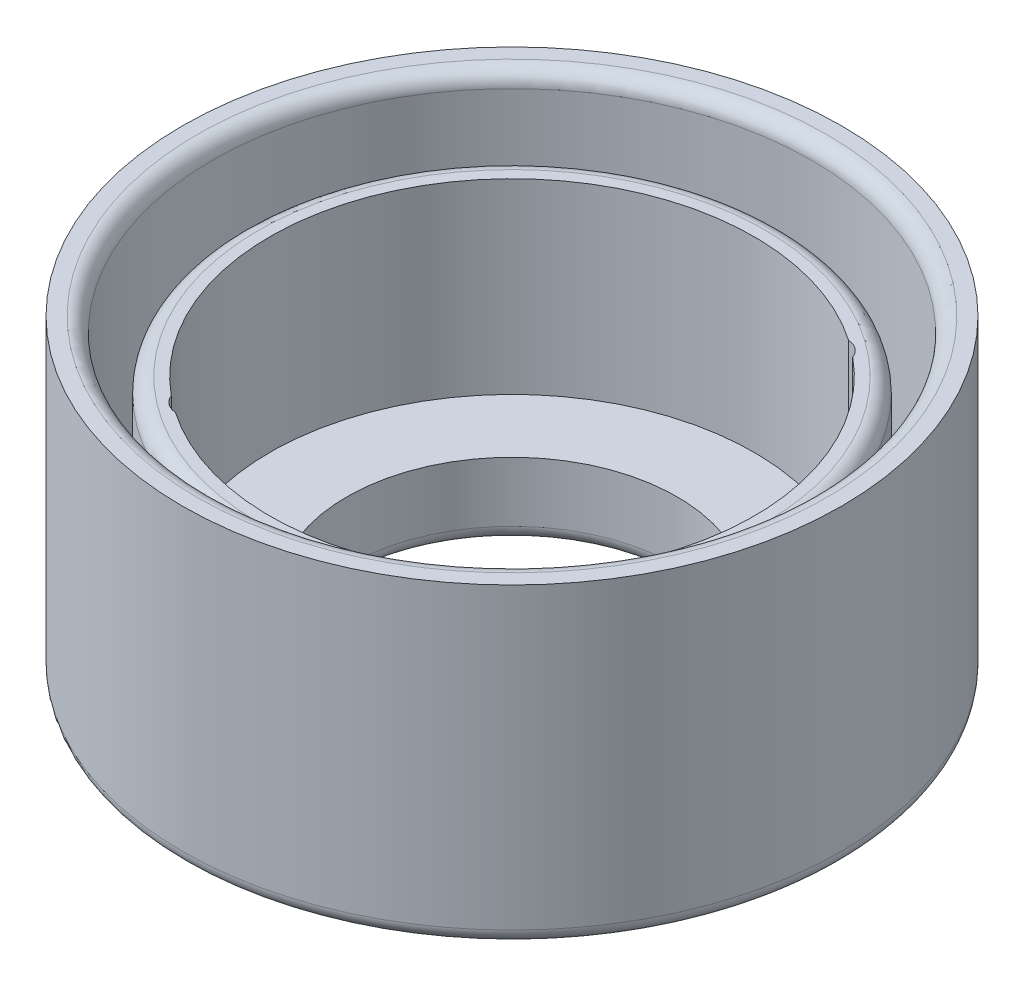
ISO-10303-21;
HEADER;
FILE_DESCRIPTION(('STEP AP214'),'2;1');
FILE_NAME('part.step','',(''),(''),'','','');
FILE_SCHEMA(('AUTOMOTIVE_DESIGN { 1 0 10303 214 1 1 1 1 }'));
ENDSEC;
DATA;
#1=APPLICATION_CONTEXT('core data for automotive mechanical design processes');
#2=APPLICATION_PROTOCOL_DEFINITION('international standard','automotive_design',2000,#1);
#3=PRODUCT_CONTEXT('',#1,'mechanical');
#4=PRODUCT('Part','Part','',(#3));
#5=PRODUCT_RELATED_PRODUCT_CATEGORY('part','',(#4));
#6=PRODUCT_DEFINITION_FORMATION('','',#4);
#7=PRODUCT_DEFINITION_CONTEXT('part definition',#1,'design');
#8=PRODUCT_DEFINITION('design','',#6,#7);
#9=PRODUCT_DEFINITION_SHAPE('','',#8);
#10=(LENGTH_UNIT() NAMED_UNIT(*) SI_UNIT(.MILLI.,.METRE.));
#11=(NAMED_UNIT(*) PLANE_ANGLE_UNIT() SI_UNIT($,.RADIAN.));
#12=(NAMED_UNIT(*) SI_UNIT($,.STERADIAN.) SOLID_ANGLE_UNIT());
#13=UNCERTAINTY_MEASURE_WITH_UNIT(LENGTH_MEASURE(1.E-05),#10,'distance_accuracy_value','');
#14=(GEOMETRIC_REPRESENTATION_CONTEXT(3) GLOBAL_UNCERTAINTY_ASSIGNED_CONTEXT((#13)) GLOBAL_UNIT_ASSIGNED_CONTEXT((#10,
#11,#12)) REPRESENTATION_CONTEXT('',''));
#15=CARTESIAN_POINT('',(0.,0.,0.));
#16=DIRECTION('',(0.,0.,1.));
#17=DIRECTION('',(1.,0.,0.));
#18=AXIS2_PLACEMENT_3D('',#15,#16,#17);
#19=CARTESIAN_POINT('',(9.1,16.001,-12.1));
#20=DIRECTION('',(0.,-1.,0.));
#21=DIRECTION('',(0.,0.,-1.));
#22=AXIS2_PLACEMENT_3D('',#19,#20,#21);
#23=CYLINDRICAL_SURFACE('',#22,1.25);
#24=DIRECTION('',(0.,-1.,0.));
#25=VECTOR('',#24,1.);
#26=CARTESIAN_POINT('',(9.18081222849627,6.25,-13.3473850182383));
#27=LINE('',#26,#25);
#28=CARTESIAN_POINT('',(9.18081222849627,0.,-13.3473850182383));
#29=VERTEX_POINT('',#28);
#30=CARTESIAN_POINT('',(9.18081222849626,12.5,-13.3473850182383));
#31=VERTEX_POINT('',#30);
#32=EDGE_CURVE('E50',#29,#31,#27,.F.);
#33=ORIENTED_EDGE('',*,*,#32,.F.);
#34=CARTESIAN_POINT('',(9.1,0.,-12.1));
#35=DIRECTION('',(0.,1.,0.));
#36=DIRECTION('',(0.,0.,1.));
#37=AXIS2_PLACEMENT_3D('',#34,#35,#36);
#38=CIRCLE('',#37,1.25);
#39=CARTESIAN_POINT('',(10.2759858257747,0.,-12.5237420649132));
#40=VERTEX_POINT('',#39);
#41=EDGE_CURVE('E75',#40,#29,#38,.F.);
#42=ORIENTED_EDGE('',*,*,#41,.F.);
#43=DIRECTION('',(0.,-1.,0.));
#44=VECTOR('',#43,1.);
#45=CARTESIAN_POINT('',(10.2759858257747,6.25,-12.5237420649132));
#46=LINE('',#45,#44);
#47=CARTESIAN_POINT('',(10.2759858257747,12.5,-12.5237420649132));
#48=VERTEX_POINT('',#47);
#49=EDGE_CURVE('E77',#48,#40,#46,.T.);
#50=ORIENTED_EDGE('',*,*,#49,.F.);
#51=CARTESIAN_POINT('',(9.1,12.5,-12.1));
#52=DIRECTION('',(0.,1.,0.));
#53=DIRECTION('',(0.,0.,1.));
#54=AXIS2_PLACEMENT_3D('',#51,#52,#53);
#55=CIRCLE('',#54,1.25);
#56=EDGE_CURVE('E193',#31,#48,#55,.F.);
#57=ORIENTED_EDGE('',*,*,#56,.F.);
#58=EDGE_LOOP('',(#33,#42,#50,#57));
#59=FACE_BOUND('',#58,.T.);
#60=CARTESIAN_POINT('',(9.1,-2.,-12.1));
#61=DIRECTION('',(0.,-1.,0.));
#62=DIRECTION('',(0.,0.,-1.));
#63=AXIS2_PLACEMENT_3D('',#60,#61,#62);
#64=CIRCLE('',#63,1.25);
#65=CARTESIAN_POINT('',(9.1,-2.,-13.35));
#66=VERTEX_POINT('',#65);
#67=EDGE_CURVE('E257',#66,#66,#64,.T.);
#68=ORIENTED_EDGE('',*,*,#67,.T.);
#69=EDGE_LOOP('',(#68));
#70=FACE_BOUND('',#69,.T.);
#71=ADVANCED_FACE('F35',(#59,#70),#23,.F.);
#72=CARTESIAN_POINT('',(-9.1,16.001,12.1));
#73=DIRECTION('',(0.,-1.,0.));
#74=DIRECTION('',(0.,0.,-1.));
#75=AXIS2_PLACEMENT_3D('',#72,#73,#74);
#76=CYLINDRICAL_SURFACE('',#75,1.25);
#77=DIRECTION('',(0.,-1.,0.));
#78=VECTOR('',#77,1.);
#79=CARTESIAN_POINT('',(-9.18081222849627,6.25,13.3473850182383));
#80=LINE('',#79,#78);
#81=CARTESIAN_POINT('',(-9.18081222849626,0.,13.3473850182383));
#82=VERTEX_POINT('',#81);
#83=CARTESIAN_POINT('',(-9.18081222849626,12.5,13.3473850182383));
#84=VERTEX_POINT('',#83);
#85=EDGE_CURVE('E203',#82,#84,#80,.F.);
#86=ORIENTED_EDGE('',*,*,#85,.F.);
#87=CARTESIAN_POINT('',(-9.1,0.,12.1));
#88=DIRECTION('',(0.,1.,0.));
#89=DIRECTION('',(0.,0.,1.));
#90=AXIS2_PLACEMENT_3D('',#87,#88,#89);
#91=CIRCLE('',#90,1.25);
#92=CARTESIAN_POINT('',(-10.2759858257747,0.,12.5237420649132));
#93=VERTEX_POINT('',#92);
#94=EDGE_CURVE('E92',#93,#82,#91,.F.);
#95=ORIENTED_EDGE('',*,*,#94,.F.);
#96=DIRECTION('',(0.,-1.,0.));
#97=VECTOR('',#96,1.);
#98=CARTESIAN_POINT('',(-10.2759858257747,6.25,12.5237420649132));
#99=LINE('',#98,#97);
#100=CARTESIAN_POINT('',(-10.2759858257747,12.5,12.5237420649132));
#101=VERTEX_POINT('',#100);
#102=EDGE_CURVE('E197',#101,#93,#99,.T.);
#103=ORIENTED_EDGE('',*,*,#102,.F.);
#104=CARTESIAN_POINT('',(-9.1,12.5,12.1));
#105=DIRECTION('',(0.,1.,0.));
#106=DIRECTION('',(0.,0.,1.));
#107=AXIS2_PLACEMENT_3D('',#104,#105,#106);
#108=CIRCLE('',#107,1.25);
#109=EDGE_CURVE('E205',#84,#101,#108,.F.);
#110=ORIENTED_EDGE('',*,*,#109,.F.);
#111=EDGE_LOOP('',(#86,#95,#103,#110));
#112=FACE_BOUND('',#111,.T.);
#113=CARTESIAN_POINT('',(-9.1,-2.,12.1));
#114=DIRECTION('',(0.,-1.,0.));
#115=DIRECTION('',(0.,0.,-1.));
#116=AXIS2_PLACEMENT_3D('',#113,#114,#115);
#117=CIRCLE('',#116,1.25);
#118=CARTESIAN_POINT('',(-9.1,-2.,10.85));
#119=VERTEX_POINT('',#118);
#120=EDGE_CURVE('E219',#119,#119,#117,.T.);
#121=ORIENTED_EDGE('',*,*,#120,.T.);
#122=EDGE_LOOP('',(#121));
#123=FACE_BOUND('',#122,.T.);
#124=ADVANCED_FACE('F134',(#112,#123),#76,.F.);
#125=CARTESIAN_POINT('',(0.,12.5,0.));
#126=DIRECTION('',(0.,-1.,0.));
#127=DIRECTION('',(0.,0.,-1.));
#128=AXIS2_PLACEMENT_3D('',#125,#126,#127);
#129=CYLINDRICAL_SURFACE('',#128,16.2);
#130=ORIENTED_EDGE('',*,*,#49,.T.);
#131=CARTESIAN_POINT('',(0.,0.,0.));
#132=DIRECTION('',(0.,1.,0.));
#133=DIRECTION('',(0.,0.,1.));
#134=AXIS2_PLACEMENT_3D('',#131,#132,#133);
#135=CIRCLE('',#134,16.2);
#136=EDGE_CURVE('E58',#40,#82,#135,.F.);
#137=ORIENTED_EDGE('',*,*,#136,.T.);
#138=ORIENTED_EDGE('',*,*,#85,.T.);
#139=CARTESIAN_POINT('',(0.,12.5,0.));
#140=DIRECTION('',(0.,1.,0.));
#141=DIRECTION('',(0.,0.,1.));
#142=AXIS2_PLACEMENT_3D('',#139,#140,#141);
#143=CIRCLE('',#142,16.2);
#144=EDGE_CURVE('E87',#84,#48,#143,.T.);
#145=ORIENTED_EDGE('',*,*,#144,.T.);
#146=EDGE_LOOP('',(#130,#137,#138,#145));
#147=FACE_BOUND('',#146,.T.);
#148=ADVANCED_FACE('F85',(#147),#129,.F.);
#149=CARTESIAN_POINT('',(0.,16.,0.));
#150=DIRECTION('',(0.,-1.,0.));
#151=DIRECTION('',(0.,0.,-1.));
#152=AXIS2_PLACEMENT_3D('',#149,#150,#151);
#153=CYLINDRICAL_SURFACE('',#152,20.05);
#154=CARTESIAN_POINT('',(0.,15.,0.));
#155=DIRECTION('',(0.,1.,0.));
#156=DIRECTION('',(0.,0.,1.));
#157=AXIS2_PLACEMENT_3D('',#154,#155,#156);
#158=CIRCLE('',#157,20.05);
#159=CARTESIAN_POINT('',(0.,15.,20.05));
#160=VERTEX_POINT('',#159);
#161=EDGE_CURVE('E113',#160,#160,#158,.T.);
#162=ORIENTED_EDGE('',*,*,#161,.T.);
#163=EDGE_LOOP('',(#162));
#164=FACE_BOUND('',#163,.T.);
#165=CARTESIAN_POINT('',(0.,0.,0.));
#166=DIRECTION('',(0.,1.,0.));
#167=DIRECTION('',(0.,0.,1.));
#168=AXIS2_PLACEMENT_3D('',#165,#166,#167);
#169=CIRCLE('',#168,20.05);
#170=CARTESIAN_POINT('',(0.,0.,20.05));
#171=VERTEX_POINT('',#170);
#172=EDGE_CURVE('E98',#171,#171,#169,.T.);
#173=ORIENTED_EDGE('',*,*,#172,.F.);
#174=EDGE_LOOP('',(#173));
#175=FACE_BOUND('',#174,.T.);
#176=ADVANCED_FACE('F175',(#164,#175),#153,.F.);
#177=CARTESIAN_POINT('',(0.,16.,0.));
#178=DIRECTION('',(0.,-1.,0.));
#179=DIRECTION('',(0.,0.,-1.));
#180=AXIS2_PLACEMENT_3D('',#177,#178,#179);
#181=CYLINDRICAL_SURFACE('',#180,22.05);
#182=CARTESIAN_POINT('',(0.,-4.,0.));
#183=DIRECTION('',(0.,1.,0.));
#184=DIRECTION('',(0.,0.,1.));
#185=AXIS2_PLACEMENT_3D('',#182,#183,#184);
#186=CIRCLE('',#185,22.05);
#187=CARTESIAN_POINT('',(0.,-4.,22.05));
#188=VERTEX_POINT('',#187);
#189=EDGE_CURVE('E43',#188,#188,#186,.T.);
#190=ORIENTED_EDGE('',*,*,#189,.T.);
#191=EDGE_LOOP('',(#190));
#192=FACE_BOUND('',#191,.T.);
#193=CARTESIAN_POINT('',(0.,16.,0.));
#194=DIRECTION('',(0.,1.,0.));
#195=DIRECTION('',(0.,0.,1.));
#196=AXIS2_PLACEMENT_3D('',#193,#194,#195);
#197=CIRCLE('',#196,22.05);
#198=CARTESIAN_POINT('',(0.,16.,22.05));
#199=VERTEX_POINT('',#198);
#200=EDGE_CURVE('E94',#199,#199,#197,.T.);
#201=ORIENTED_EDGE('',*,*,#200,.F.);
#202=EDGE_LOOP('',(#201));
#203=FACE_BOUND('',#202,.T.);
#204=ADVANCED_FACE('F121',(#192,#203),#181,.T.);
#205=CARTESIAN_POINT('',(0.,16.,0.));
#206=DIRECTION('',(0.,1.,0.));
#207=DIRECTION('',(0.,0.,1.));
#208=AXIS2_PLACEMENT_3D('',#205,#206,#207);
#209=PLANE('',#208);
#210=CARTESIAN_POINT('',(0.,16.,0.));
#211=DIRECTION('',(0.,1.,0.));
#212=DIRECTION('',(0.,0.,1.));
#213=AXIS2_PLACEMENT_3D('',#210,#211,#212);
#214=CIRCLE('',#213,21.05);
#215=CARTESIAN_POINT('',(0.,16.,21.05));
#216=VERTEX_POINT('',#215);
#217=EDGE_CURVE('E116',#216,#216,#214,.F.);
#218=ORIENTED_EDGE('',*,*,#217,.T.);
#219=EDGE_LOOP('',(#218));
#220=FACE_BOUND('',#219,.T.);
#221=ORIENTED_EDGE('',*,*,#200,.T.);
#222=EDGE_LOOP('',(#221));
#223=FACE_BOUND('',#222,.T.);
#224=ADVANCED_FACE('F165',(#220,#223),#209,.T.);
#225=CARTESIAN_POINT('',(0.,-5.,0.));
#226=DIRECTION('',(0.,1.,0.));
#227=DIRECTION('',(0.,0.,1.));
#228=AXIS2_PLACEMENT_3D('',#225,#226,#227);
#229=PLANE('',#228);
#230=CARTESIAN_POINT('',(0.,-5.,0.));
#231=DIRECTION('',(0.,1.,0.));
#232=DIRECTION('',(0.,0.,1.));
#233=AXIS2_PLACEMENT_3D('',#230,#231,#232);
#234=CIRCLE('',#233,21.05);
#235=CARTESIAN_POINT('',(0.,-5.,21.05));
#236=VERTEX_POINT('',#235);
#237=EDGE_CURVE('E11',#236,#236,#234,.F.);
#238=ORIENTED_EDGE('',*,*,#237,.T.);
#239=EDGE_LOOP('',(#238));
#240=FACE_BOUND('',#239,.T.);
#241=CARTESIAN_POINT('',(0.,-5.,0.));
#242=DIRECTION('',(0.,1.,0.));
#243=DIRECTION('',(0.,0.,1.));
#244=AXIS2_PLACEMENT_3D('',#241,#242,#243);
#245=CIRCLE('',#244,12.05);
#246=CARTESIAN_POINT('',(0.,-5.,12.05));
#247=VERTEX_POINT('',#246);
#248=EDGE_CURVE('E104',#247,#247,#245,.T.);
#249=ORIENTED_EDGE('',*,*,#248,.T.);
#250=EDGE_LOOP('',(#249));
#251=FACE_BOUND('',#250,.T.);
#252=CARTESIAN_POINT('',(9.1,-5.,-12.1));
#253=DIRECTION('',(0.,-1.,0.));
#254=DIRECTION('',(0.,0.,-1.));
#255=AXIS2_PLACEMENT_3D('',#252,#253,#254);
#256=CIRCLE('',#255,2.5);
#257=CARTESIAN_POINT('',(9.1,-5.,-14.6));
#258=VERTEX_POINT('',#257);
#259=EDGE_CURVE('E227',#258,#258,#256,.T.);
#260=ORIENTED_EDGE('',*,*,#259,.F.);
#261=EDGE_LOOP('',(#260));
#262=FACE_BOUND('',#261,.T.);
#263=CARTESIAN_POINT('',(-9.1,-5.,12.1));
#264=DIRECTION('',(0.,-1.,0.));
#265=DIRECTION('',(0.,0.,-1.));
#266=AXIS2_PLACEMENT_3D('',#263,#264,#265);
#267=CIRCLE('',#266,2.5);
#268=CARTESIAN_POINT('',(-9.1,-5.,9.6));
#269=VERTEX_POINT('',#268);
#270=EDGE_CURVE('E221',#269,#269,#267,.T.);
#271=ORIENTED_EDGE('',*,*,#270,.F.);
#272=EDGE_LOOP('',(#271));
#273=FACE_BOUND('',#272,.T.);
#274=ADVANCED_FACE('F162',(#240,#251,#262,#273),#229,.F.);
#275=CARTESIAN_POINT('',(0.,0.,0.));
#276=DIRECTION('',(0.,1.,0.));
#277=DIRECTION('',(0.,0.,1.));
#278=AXIS2_PLACEMENT_3D('',#275,#276,#277);
#279=PLANE('',#278);
#280=CARTESIAN_POINT('',(0.,0.,0.));
#281=DIRECTION('',(0.,1.,0.));
#282=DIRECTION('',(0.,0.,1.));
#283=AXIS2_PLACEMENT_3D('',#280,#281,#282);
#284=CIRCLE('',#283,17.95);
#285=CARTESIAN_POINT('',(0.,0.,17.95));
#286=VERTEX_POINT('',#285);
#287=EDGE_CURVE('E210',#286,#286,#284,.T.);
#288=ORIENTED_EDGE('',*,*,#287,.F.);
#289=EDGE_LOOP('',(#288));
#290=FACE_BOUND('',#289,.T.);
#291=ORIENTED_EDGE('',*,*,#172,.T.);
#292=EDGE_LOOP('',(#291));
#293=FACE_BOUND('',#292,.T.);
#294=ADVANCED_FACE('F160',(#290,#293),#279,.T.);
#295=ORIENTED_EDGE('',*,*,#32,.T.);
#296=EDGE_CURVE('E195',#31,#101,#143,.T.);
#297=ORIENTED_EDGE('',*,*,#296,.T.);
#298=ORIENTED_EDGE('',*,*,#102,.T.);
#299=EDGE_CURVE('E93',#93,#29,#135,.F.);
#300=ORIENTED_EDGE('',*,*,#299,.T.);
#301=EDGE_LOOP('',(#295,#297,#298,#300));
#302=FACE_BOUND('',#301,.T.);
#303=ADVANCED_FACE('F156',(#302),#129,.F.);
#304=CARTESIAN_POINT('',(0.,12.5,0.));
#305=DIRECTION('',(0.,-1.,0.));
#306=DIRECTION('',(0.,0.,-1.));
#307=AXIS2_PLACEMENT_3D('',#304,#305,#306);
#308=CYLINDRICAL_SURFACE('',#307,17.95);
#309=CARTESIAN_POINT('',(0.,11.5,0.));
#310=DIRECTION('',(0.,1.,0.));
#311=DIRECTION('',(0.,0.,1.));
#312=AXIS2_PLACEMENT_3D('',#309,#310,#311);
#313=CIRCLE('',#312,17.95);
#314=CARTESIAN_POINT('',(0.,11.5,17.95));
#315=VERTEX_POINT('',#314);
#316=EDGE_CURVE('E110',#315,#315,#313,.F.);
#317=ORIENTED_EDGE('',*,*,#316,.T.);
#318=EDGE_LOOP('',(#317));
#319=FACE_BOUND('',#318,.T.);
#320=ORIENTED_EDGE('',*,*,#287,.T.);
#321=EDGE_LOOP('',(#320));
#322=FACE_BOUND('',#321,.T.);
#323=ADVANCED_FACE('F152',(#319,#322),#308,.T.);
#324=CARTESIAN_POINT('',(0.,12.5,0.));
#325=DIRECTION('',(0.,1.,0.));
#326=DIRECTION('',(0.,0.,1.));
#327=AXIS2_PLACEMENT_3D('',#324,#325,#326);
#328=PLANE('',#327);
#329=CARTESIAN_POINT('',(0.,12.5,0.));
#330=DIRECTION('',(0.,1.,0.));
#331=DIRECTION('',(0.,0.,1.));
#332=AXIS2_PLACEMENT_3D('',#329,#330,#331);
#333=CIRCLE('',#332,16.95);
#334=CARTESIAN_POINT('',(0.,12.5,16.95));
#335=VERTEX_POINT('',#334);
#336=EDGE_CURVE('E107',#335,#335,#333,.T.);
#337=ORIENTED_EDGE('',*,*,#336,.T.);
#338=EDGE_LOOP('',(#337));
#339=FACE_BOUND('',#338,.T.);
#340=ORIENTED_EDGE('',*,*,#56,.T.);
#341=ORIENTED_EDGE('',*,*,#144,.F.);
#342=ORIENTED_EDGE('',*,*,#109,.T.);
#343=ORIENTED_EDGE('',*,*,#296,.F.);
#344=EDGE_LOOP('',(#340,#341,#342,#343));
#345=FACE_BOUND('',#344,.T.);
#346=ADVANCED_FACE('F149',(#339,#345),#328,.T.);
#347=ORIENTED_EDGE('',*,*,#41,.T.);
#348=ORIENTED_EDGE('',*,*,#299,.F.);
#349=ORIENTED_EDGE('',*,*,#94,.T.);
#350=ORIENTED_EDGE('',*,*,#136,.F.);
#351=EDGE_LOOP('',(#347,#348,#349,#350));
#352=FACE_BOUND('',#351,.T.);
#353=CARTESIAN_POINT('',(0.,0.,0.));
#354=DIRECTION('',(0.,1.,0.));
#355=DIRECTION('',(0.,0.,1.));
#356=AXIS2_PLACEMENT_3D('',#353,#354,#355);
#357=CIRCLE('',#356,11.05);
#358=CARTESIAN_POINT('',(0.,0.,11.05));
#359=VERTEX_POINT('',#358);
#360=EDGE_CURVE('E207',#359,#359,#357,.F.);
#361=ORIENTED_EDGE('',*,*,#360,.T.);
#362=EDGE_LOOP('',(#361));
#363=FACE_BOUND('',#362,.T.);
#364=ADVANCED_FACE('F90',(#352,#363),#279,.T.);
#365=CARTESIAN_POINT('',(0.,16.001,0.));
#366=DIRECTION('',(0.,-1.,0.));
#367=DIRECTION('',(0.,0.,-1.));
#368=AXIS2_PLACEMENT_3D('',#365,#366,#367);
#369=CYLINDRICAL_SURFACE('',#368,11.05);
#370=CARTESIAN_POINT('',(0.,-4.,0.));
#371=DIRECTION('',(0.,1.,0.));
#372=DIRECTION('',(0.,0.,1.));
#373=AXIS2_PLACEMENT_3D('',#370,#371,#372);
#374=CIRCLE('',#373,11.05);
#375=CARTESIAN_POINT('',(0.,-4.,11.05));
#376=VERTEX_POINT('',#375);
#377=EDGE_CURVE('E96',#376,#376,#374,.F.);
#378=ORIENTED_EDGE('',*,*,#377,.T.);
#379=EDGE_LOOP('',(#378));
#380=FACE_BOUND('',#379,.T.);
#381=ORIENTED_EDGE('',*,*,#360,.F.);
#382=EDGE_LOOP('',(#381));
#383=FACE_BOUND('',#382,.T.);
#384=ADVANCED_FACE('F145',(#380,#383),#369,.F.);
#385=CARTESIAN_POINT('',(-9.1,-2.,12.1));
#386=DIRECTION('',(0.,-1.,0.));
#387=DIRECTION('',(0.,0.,-1.));
#388=AXIS2_PLACEMENT_3D('',#385,#386,#387);
#389=CYLINDRICAL_SURFACE('',#388,2.5);
#390=CARTESIAN_POINT('',(-9.1,-2.,12.1));
#391=DIRECTION('',(0.,-1.,0.));
#392=DIRECTION('',(0.,0.,-1.));
#393=AXIS2_PLACEMENT_3D('',#390,#391,#392);
#394=CIRCLE('',#393,2.5);
#395=CARTESIAN_POINT('',(-9.1,-2.,9.6));
#396=VERTEX_POINT('',#395);
#397=EDGE_CURVE('E82',#396,#396,#394,.T.);
#398=ORIENTED_EDGE('',*,*,#397,.F.);
#399=EDGE_LOOP('',(#398));
#400=FACE_BOUND('',#399,.T.);
#401=ORIENTED_EDGE('',*,*,#270,.T.);
#402=EDGE_LOOP('',(#401));
#403=FACE_BOUND('',#402,.T.);
#404=ADVANCED_FACE('F142',(#400,#403),#389,.F.);
#405=CARTESIAN_POINT('',(-9.1,-2.,12.1));
#406=DIRECTION('',(0.,-1.,0.));
#407=DIRECTION('',(0.,0.,-1.));
#408=AXIS2_PLACEMENT_3D('',#405,#406,#407);
#409=PLANE('',#408);
#410=ORIENTED_EDGE('',*,*,#120,.F.);
#411=EDGE_LOOP('',(#410));
#412=FACE_BOUND('',#411,.T.);
#413=ORIENTED_EDGE('',*,*,#397,.T.);
#414=EDGE_LOOP('',(#413));
#415=FACE_BOUND('',#414,.T.);
#416=ADVANCED_FACE('F234',(#412,#415),#409,.T.);
#417=CARTESIAN_POINT('',(9.1,-2.,-12.1));
#418=DIRECTION('',(0.,-1.,0.));
#419=DIRECTION('',(0.,0.,-1.));
#420=AXIS2_PLACEMENT_3D('',#417,#418,#419);
#421=CYLINDRICAL_SURFACE('',#420,2.5);
#422=CARTESIAN_POINT('',(9.1,-2.,-12.1));
#423=DIRECTION('',(0.,-1.,0.));
#424=DIRECTION('',(0.,0.,-1.));
#425=AXIS2_PLACEMENT_3D('',#422,#423,#424);
#426=CIRCLE('',#425,2.5);
#427=CARTESIAN_POINT('',(9.1,-2.,-14.6));
#428=VERTEX_POINT('',#427);
#429=EDGE_CURVE('E222',#428,#428,#426,.T.);
#430=ORIENTED_EDGE('',*,*,#429,.F.);
#431=EDGE_LOOP('',(#430));
#432=FACE_BOUND('',#431,.T.);
#433=ORIENTED_EDGE('',*,*,#259,.T.);
#434=EDGE_LOOP('',(#433));
#435=FACE_BOUND('',#434,.T.);
#436=ADVANCED_FACE('F243',(#432,#435),#421,.F.);
#437=CARTESIAN_POINT('',(9.1,-2.,-12.1));
#438=DIRECTION('',(0.,-1.,0.));
#439=DIRECTION('',(0.,0.,-1.));
#440=AXIS2_PLACEMENT_3D('',#437,#438,#439);
#441=PLANE('',#440);
#442=ORIENTED_EDGE('',*,*,#67,.F.);
#443=EDGE_LOOP('',(#442));
#444=FACE_BOUND('',#443,.T.);
#445=ORIENTED_EDGE('',*,*,#429,.T.);
#446=EDGE_LOOP('',(#445));
#447=FACE_BOUND('',#446,.T.);
#448=ADVANCED_FACE('F182',(#444,#447),#441,.T.);
#449=CARTESIAN_POINT('',(0.,-4.,0.));
#450=DIRECTION('',(0.,1.,0.));
#451=DIRECTION('',(0.,0.,1.));
#452=AXIS2_PLACEMENT_3D('',#449,#450,#451);
#453=TOROIDAL_SURFACE('',#452,12.05,1.);
#454=ORIENTED_EDGE('',*,*,#248,.F.);
#455=EDGE_LOOP('',(#454));
#456=FACE_BOUND('',#455,.T.);
#457=ORIENTED_EDGE('',*,*,#377,.F.);
#458=EDGE_LOOP('',(#457));
#459=FACE_BOUND('',#458,.T.);
#460=ADVANCED_FACE('F179',(#456,#459),#453,.T.);
#461=CARTESIAN_POINT('',(0.,11.5,0.));
#462=DIRECTION('',(0.,1.,0.));
#463=DIRECTION('',(0.,0.,1.));
#464=AXIS2_PLACEMENT_3D('',#461,#462,#463);
#465=TOROIDAL_SURFACE('',#464,16.95,1.);
#466=ORIENTED_EDGE('',*,*,#316,.F.);
#467=EDGE_LOOP('',(#466));
#468=FACE_BOUND('',#467,.T.);
#469=ORIENTED_EDGE('',*,*,#336,.F.);
#470=EDGE_LOOP('',(#469));
#471=FACE_BOUND('',#470,.T.);
#472=ADVANCED_FACE('F130',(#468,#471),#465,.T.);
#473=CARTESIAN_POINT('',(0.,15.,0.));
#474=DIRECTION('',(0.,1.,0.));
#475=DIRECTION('',(0.,0.,1.));
#476=AXIS2_PLACEMENT_3D('',#473,#474,#475);
#477=TOROIDAL_SURFACE('',#476,21.05,1.);
#478=ORIENTED_EDGE('',*,*,#217,.F.);
#479=EDGE_LOOP('',(#478));
#480=FACE_BOUND('',#479,.T.);
#481=ORIENTED_EDGE('',*,*,#161,.F.);
#482=EDGE_LOOP('',(#481));
#483=FACE_BOUND('',#482,.T.);
#484=ADVANCED_FACE('F125',(#480,#483),#477,.T.);
#485=CARTESIAN_POINT('',(0.,-4.,0.));
#486=DIRECTION('',(0.,1.,0.));
#487=DIRECTION('',(0.,0.,1.));
#488=AXIS2_PLACEMENT_3D('',#485,#486,#487);
#489=TOROIDAL_SURFACE('',#488,21.05,1.);
#490=ORIENTED_EDGE('',*,*,#237,.F.);
#491=EDGE_LOOP('',(#490));
#492=FACE_BOUND('',#491,.T.);
#493=ORIENTED_EDGE('',*,*,#189,.F.);
#494=EDGE_LOOP('',(#493));
#495=FACE_BOUND('',#494,.T.);
#496=ADVANCED_FACE('F37',(#492,#495),#489,.T.);
#497=CLOSED_SHELL('',(#71,#124,#148,#176,#204,#224,#274,#294,#303,#323,#346,#364,#384,#404,#416,
#436,#448,#460,#472,#484,#496));
#498=MANIFOLD_SOLID_BREP('B2',#497);
#499=ADVANCED_BREP_SHAPE_REPRESENTATION('',(#18,#498),#14);
#500=SHAPE_DEFINITION_REPRESENTATION(#9,#499);
ENDSEC;
END-ISO-10303-21;
